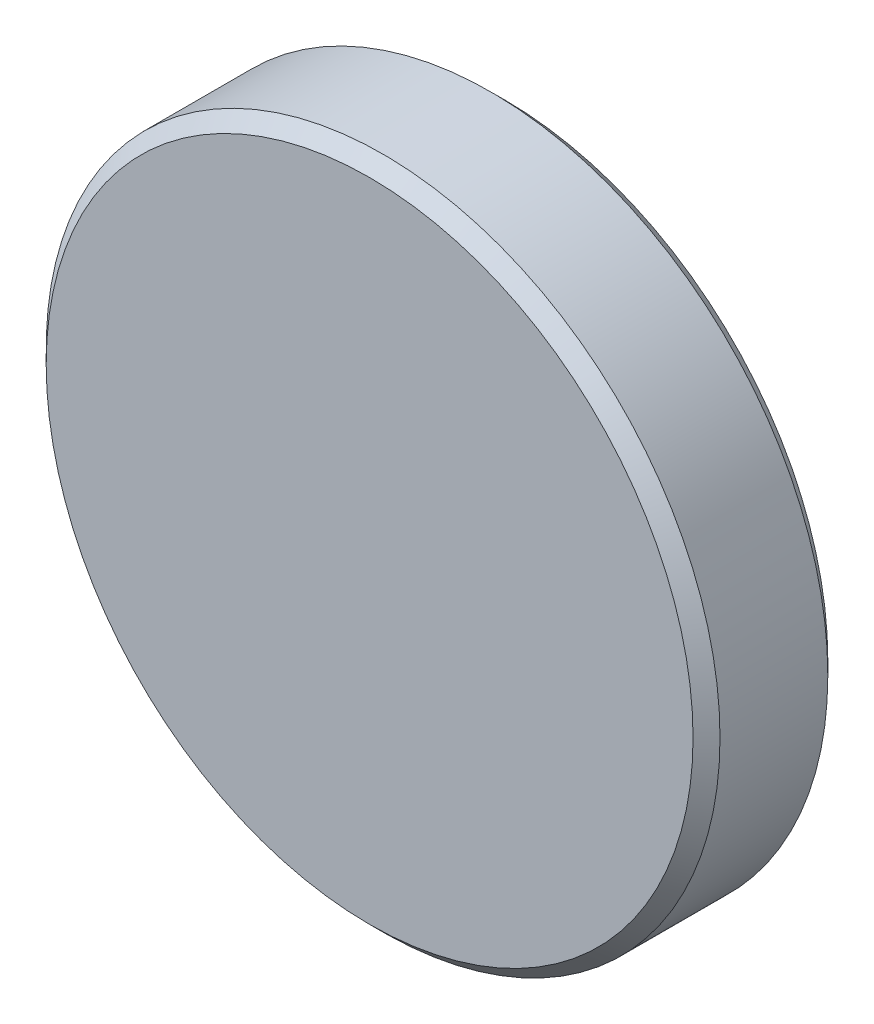
ISO-10303-21;
HEADER;
FILE_DESCRIPTION(('STEP AP214'),'2;1');
FILE_NAME('part.step','',(''),(''),'','','');
FILE_SCHEMA(('AUTOMOTIVE_DESIGN { 1 0 10303 214 1 1 1 1 }'));
ENDSEC;
DATA;
#1=APPLICATION_CONTEXT('core data for automotive mechanical design processes');
#2=APPLICATION_PROTOCOL_DEFINITION('international standard','automotive_design',2000,#1);
#3=PRODUCT_CONTEXT('',#1,'mechanical');
#4=PRODUCT('Part','Part','',(#3));
#5=PRODUCT_RELATED_PRODUCT_CATEGORY('part','',(#4));
#6=PRODUCT_DEFINITION_FORMATION('','',#4);
#7=PRODUCT_DEFINITION_CONTEXT('part definition',#1,'design');
#8=PRODUCT_DEFINITION('design','',#6,#7);
#9=PRODUCT_DEFINITION_SHAPE('','',#8);
#10=(LENGTH_UNIT() NAMED_UNIT(*) SI_UNIT(.MILLI.,.METRE.));
#11=(NAMED_UNIT(*) PLANE_ANGLE_UNIT() SI_UNIT($,.RADIAN.));
#12=(NAMED_UNIT(*) SI_UNIT($,.STERADIAN.) SOLID_ANGLE_UNIT());
#13=UNCERTAINTY_MEASURE_WITH_UNIT(LENGTH_MEASURE(1.E-05),#10,'distance_accuracy_value','');
#14=(GEOMETRIC_REPRESENTATION_CONTEXT(3) GLOBAL_UNCERTAINTY_ASSIGNED_CONTEXT((#13)) GLOBAL_UNIT_ASSIGNED_CONTEXT((#10,
#11,#12)) REPRESENTATION_CONTEXT('',''));
#15=CARTESIAN_POINT('',(0.,0.,0.));
#16=DIRECTION('',(0.,0.,1.));
#17=DIRECTION('',(1.,0.,0.));
#18=AXIS2_PLACEMENT_3D('',#15,#16,#17);
#19=CARTESIAN_POINT('',(0.,0.,1.));
#20=DIRECTION('',(0.,0.,-1.));
#21=DIRECTION('',(-1.,0.,0.));
#22=AXIS2_PLACEMENT_3D('',#19,#20,#21);
#23=CYLINDRICAL_SURFACE('',#22,2.5);
#24=CARTESIAN_POINT('',(0.,0.,0.0999999999999994));
#25=DIRECTION('',(0.,0.,1.));
#26=DIRECTION('',(1.,0.,0.));
#27=AXIS2_PLACEMENT_3D('',#24,#25,#26);
#28=CIRCLE('',#27,2.5);
#29=CARTESIAN_POINT('',(2.5,0.,0.0999999999999994));
#30=VERTEX_POINT('',#29);
#31=EDGE_CURVE('E57',#30,#30,#28,.T.);
#32=ORIENTED_EDGE('',*,*,#31,.T.);
#33=EDGE_LOOP('',(#32));
#34=FACE_BOUND('',#33,.T.);
#35=CARTESIAN_POINT('',(0.,0.,0.899999999999998));
#36=DIRECTION('',(0.,0.,1.));
#37=DIRECTION('',(1.,0.,0.));
#38=AXIS2_PLACEMENT_3D('',#35,#36,#37);
#39=CIRCLE('',#38,2.5);
#40=CARTESIAN_POINT('',(2.5,0.,0.899999999999998));
#41=VERTEX_POINT('',#40);
#42=EDGE_CURVE('E62',#41,#41,#39,.F.);
#43=ORIENTED_EDGE('',*,*,#42,.T.);
#44=EDGE_LOOP('',(#43));
#45=FACE_BOUND('',#44,.T.);
#46=ADVANCED_FACE('F43',(#34,#45),#23,.T.);
#47=CARTESIAN_POINT('',(0.,0.,1.));
#48=DIRECTION('',(0.,0.,1.));
#49=DIRECTION('',(1.,0.,0.));
#50=AXIS2_PLACEMENT_3D('',#47,#48,#49);
#51=PLANE('',#50);
#52=CARTESIAN_POINT('',(0.,0.,1.));
#53=DIRECTION('',(0.,0.,1.));
#54=DIRECTION('',(1.,0.,0.));
#55=AXIS2_PLACEMENT_3D('',#52,#53,#54);
#56=CIRCLE('',#55,2.4);
#57=CARTESIAN_POINT('',(2.4,0.,1.));
#58=VERTEX_POINT('',#57);
#59=EDGE_CURVE('E10',#58,#58,#56,.T.);
#60=ORIENTED_EDGE('',*,*,#59,.T.);
#61=EDGE_LOOP('',(#60));
#62=FACE_BOUND('',#61,.T.);
#63=ADVANCED_FACE('F79',(#62),#51,.T.);
#64=CARTESIAN_POINT('',(0.,0.,0.));
#65=DIRECTION('',(0.,0.,1.));
#66=DIRECTION('',(1.,0.,0.));
#67=AXIS2_PLACEMENT_3D('',#64,#65,#66);
#68=PLANE('',#67);
#69=CARTESIAN_POINT('',(0.,0.,0.));
#70=DIRECTION('',(0.,0.,1.));
#71=DIRECTION('',(1.,0.,0.));
#72=AXIS2_PLACEMENT_3D('',#69,#70,#71);
#73=CIRCLE('',#72,2.4);
#74=CARTESIAN_POINT('',(2.4,0.,0.));
#75=VERTEX_POINT('',#74);
#76=EDGE_CURVE('E52',#75,#75,#73,.F.);
#77=ORIENTED_EDGE('',*,*,#76,.T.);
#78=EDGE_LOOP('',(#77));
#79=FACE_BOUND('',#78,.T.);
#80=ADVANCED_FACE('F76',(#79),#68,.F.);
#81=CARTESIAN_POINT('',(0.,0.,0.0999999999999994));
#82=DIRECTION('',(0.,0.,1.));
#83=DIRECTION('',(1.,0.,0.));
#84=AXIS2_PLACEMENT_3D('',#81,#82,#83);
#85=CONICAL_SURFACE('',#84,2.5,0.78539816339745);
#86=ORIENTED_EDGE('',*,*,#76,.F.);
#87=EDGE_LOOP('',(#86));
#88=FACE_BOUND('',#87,.T.);
#89=ORIENTED_EDGE('',*,*,#31,.F.);
#90=EDGE_LOOP('',(#89));
#91=FACE_BOUND('',#90,.T.);
#92=ADVANCED_FACE('F72',(#88,#91),#85,.T.);
#93=CARTESIAN_POINT('',(0.,0.,1.));
#94=DIRECTION('',(0.,0.,-1.));
#95=DIRECTION('',(-1.,0.,0.));
#96=AXIS2_PLACEMENT_3D('',#93,#94,#95);
#97=CONICAL_SURFACE('',#96,2.4,0.785398163397442);
#98=ORIENTED_EDGE('',*,*,#42,.F.);
#99=EDGE_LOOP('',(#98));
#100=FACE_BOUND('',#99,.T.);
#101=ORIENTED_EDGE('',*,*,#59,.F.);
#102=EDGE_LOOP('',(#101));
#103=FACE_BOUND('',#102,.T.);
#104=ADVANCED_FACE('F46',(#100,#103),#97,.T.);
#105=CLOSED_SHELL('',(#46,#63,#80,#92,#104));
#106=MANIFOLD_SOLID_BREP('B2',#105);
#107=ADVANCED_BREP_SHAPE_REPRESENTATION('',(#18,#106),#14);
#108=SHAPE_DEFINITION_REPRESENTATION(#9,#107);
ENDSEC;
END-ISO-10303-21;
